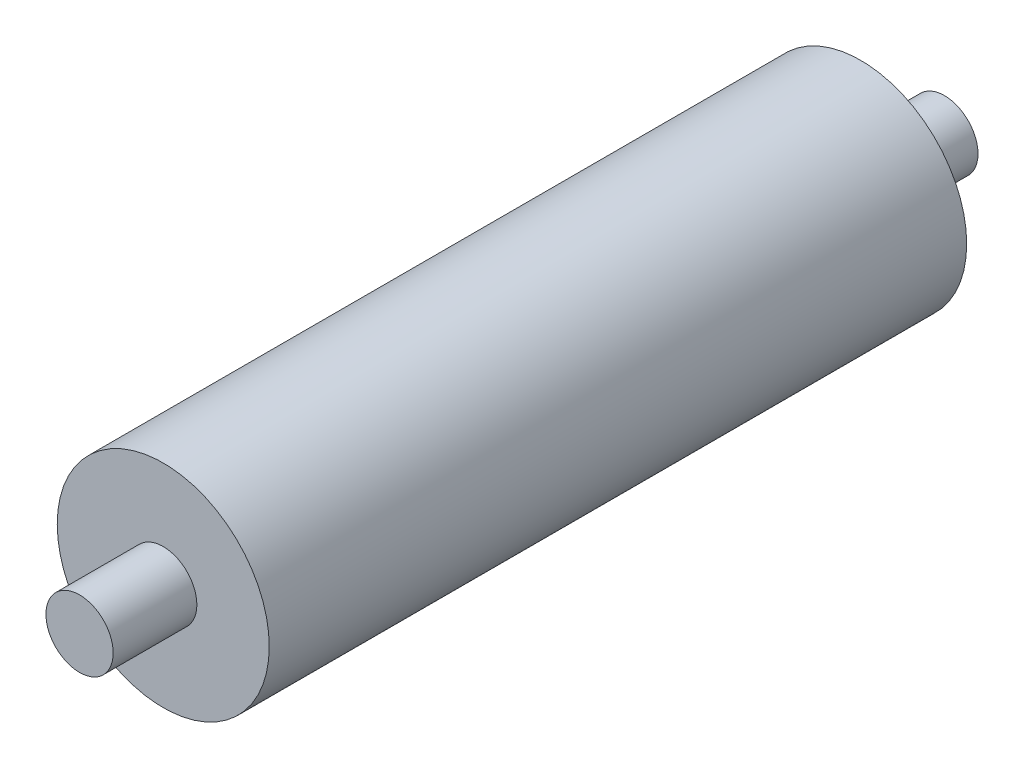
ISO-10303-21;
HEADER;
FILE_DESCRIPTION(('STEP AP214'),'2;1');
FILE_NAME('part.step','',(''),(''),'','','');
FILE_SCHEMA(('AUTOMOTIVE_DESIGN { 1 0 10303 214 1 1 1 1 }'));
ENDSEC;
DATA;
#1=APPLICATION_CONTEXT('core data for automotive mechanical design processes');
#2=APPLICATION_PROTOCOL_DEFINITION('international standard','automotive_design',2000,#1);
#3=PRODUCT_CONTEXT('',#1,'mechanical');
#4=PRODUCT('Part','Part','',(#3));
#5=PRODUCT_RELATED_PRODUCT_CATEGORY('part','',(#4));
#6=PRODUCT_DEFINITION_FORMATION('','',#4);
#7=PRODUCT_DEFINITION_CONTEXT('part definition',#1,'design');
#8=PRODUCT_DEFINITION('design','',#6,#7);
#9=PRODUCT_DEFINITION_SHAPE('','',#8);
#10=(LENGTH_UNIT() NAMED_UNIT(*) SI_UNIT(.MILLI.,.METRE.));
#11=(NAMED_UNIT(*) PLANE_ANGLE_UNIT() SI_UNIT($,.RADIAN.));
#12=(NAMED_UNIT(*) SI_UNIT($,.STERADIAN.) SOLID_ANGLE_UNIT());
#13=UNCERTAINTY_MEASURE_WITH_UNIT(LENGTH_MEASURE(1.E-05),#10,'distance_accuracy_value','');
#14=(GEOMETRIC_REPRESENTATION_CONTEXT(3) GLOBAL_UNCERTAINTY_ASSIGNED_CONTEXT((#13)) GLOBAL_UNIT_ASSIGNED_CONTEXT((#10,
#11,#12)) REPRESENTATION_CONTEXT('',''));
#15=CARTESIAN_POINT('',(0.,0.,0.));
#16=DIRECTION('',(0.,0.,1.));
#17=DIRECTION('',(1.,0.,0.));
#18=AXIS2_PLACEMENT_3D('',#15,#16,#17);
#19=CARTESIAN_POINT('',(0.,-19.,-127.5));
#20=DIRECTION('',(0.,1.,0.));
#21=DIRECTION('',(0.,0.,1.));
#22=AXIS2_PLACEMENT_3D('',#19,#20,#21);
#23=CYLINDRICAL_SURFACE('',#22,1.5);
#24=CARTESIAN_POINT('',(0.,-3.5,-126.));
#25=CARTESIAN_POINT('',(0.080152197682405,-3.49999299268885,-126.000009221439));
#26=CARTESIAN_POINT('',(0.160419992198241,-3.4972151640971,-126.006462129756));
#27=CARTESIAN_POINT('',(0.318671611361212,-3.48637069204866,-126.032039707285));
#28=CARTESIAN_POINT('',(0.396649149090577,-3.47829069608751,-126.05119636979));
#29=CARTESIAN_POINT('',(0.547768164746409,-3.45770786336707,-126.101335275199));
#30=CARTESIAN_POINT('',(0.620925386146732,-3.44522036823866,-126.132276527463));
#31=CARTESIAN_POINT('',(0.760936446071881,-3.4170283792682,-126.20493210375));
#32=CARTESIAN_POINT('',(0.827791985611414,-3.40132475720839,-126.246643509151));
#33=CARTESIAN_POINT('',(0.956920783546129,-3.36733908702934,-126.341963854125));
#34=CARTESIAN_POINT('',(1.01882024425247,-3.34896947381213,-126.396047638078));
#35=CARTESIAN_POINT('',(1.13299518436931,-3.3120882776969,-126.513571926116));
#36=CARTESIAN_POINT('',(1.18526532055665,-3.29357662187922,-126.57701759007));
#37=CARTESIAN_POINT('',(1.28142843548186,-3.25741027462363,-126.715516363707));
#38=CARTESIAN_POINT('',(1.32473406006015,-3.23985230076501,-126.791005229642));
#39=CARTESIAN_POINT('',(1.39786599574425,-3.2089808436345,-126.949054713467));
#40=CARTESIAN_POINT('',(1.42769964537364,-3.19566505070703,-127.03161145208));
#41=CARTESIAN_POINT('',(1.47147459991436,-3.17573899533535,-127.197150369309));
#42=CARTESIAN_POINT('',(1.48613747209695,-3.16882610719817,-127.279903850927));
#43=CARTESIAN_POINT('',(1.50140303570396,-3.16162424842019,-127.446962984768));
#44=CARTESIAN_POINT('',(1.50201414304565,-3.16133131294301,-127.53126767765));
#45=CARTESIAN_POINT('',(1.48969999758096,-3.16714786968021,-127.691649951849));
#46=CARTESIAN_POINT('',(1.47788056910827,-3.17273435527608,-127.767835311606));
#47=CARTESIAN_POINT('',(1.44290386406529,-3.18879205821456,-127.917013792889));
#48=CARTESIAN_POINT('',(1.41974426417223,-3.19926427650311,-127.990006256929));
#49=CARTESIAN_POINT('',(1.36228829534659,-3.22415342810443,-128.132623575738));
#50=CARTESIAN_POINT('',(1.3277598721403,-3.23865147551048,-128.202140147114));
#51=CARTESIAN_POINT('',(1.24871152436694,-3.26994246945712,-128.334673162029));
#52=CARTESIAN_POINT('',(1.20418753740298,-3.28673634798108,-128.397686947463));
#53=CARTESIAN_POINT('',(1.1017170269606,-3.32256202266194,-128.521388751812));
#54=CARTESIAN_POINT('',(1.04292364428054,-3.34165927694225,-128.581358364736));
#55=CARTESIAN_POINT('',(0.915936662025546,-3.3786730287964,-128.690835795328));
#56=CARTESIAN_POINT('',(0.847740608139985,-3.39658921627429,-128.740340872939));
#57=CARTESIAN_POINT('',(0.701592911506299,-3.4297984684468,-128.828621966404));
#58=CARTESIAN_POINT('',(0.623435574851138,-3.44501227516836,-128.867089509353));
#59=CARTESIAN_POINT('',(0.460939847079478,-3.47048698130307,-128.930075118807));
#60=CARTESIAN_POINT('',(0.376605107828834,-3.48075078019997,-128.954601352989));
#61=CARTESIAN_POINT('',(0.210138119470688,-3.49461763446686,-128.987466930229));
#62=CARTESIAN_POINT('',(0.128228980505475,-3.49861624982293,-128.996769382657));
#63=CARTESIAN_POINT('',(-0.036071650559258,-3.50077708325871,-129.001814788204));
#64=CARTESIAN_POINT('',(-0.118462985950308,-3.49894110265833,-128.997561926266));
#65=CARTESIAN_POINT('',(-0.276771219813303,-3.48989338160075,-128.976292183973));
#66=CARTESIAN_POINT('',(-0.352799465751992,-3.48297259736823,-128.959965839276));
#67=CARTESIAN_POINT('',(-0.500945568196319,-3.46476944004986,-128.915989552881));
#68=CARTESIAN_POINT('',(-0.573062936850428,-3.45348652424256,-128.888338202139));
#69=CARTESIAN_POINT('',(-0.713888482618995,-3.42719375756865,-128.821599420249));
#70=CARTESIAN_POINT('',(-0.782419874757515,-3.41207852694255,-128.782181834886));
#71=CARTESIAN_POINT('',(-0.912142452825162,-3.37971494195702,-128.693390527763));
#72=CARTESIAN_POINT('',(-0.973330487571125,-3.36246567824313,-128.644012555991));
#73=CARTESIAN_POINT('',(-1.09148379765634,-3.32607394349023,-128.532355206076));
#74=CARTESIAN_POINT('',(-1.14778308774278,-3.30688677499573,-128.46938389496));
#75=CARTESIAN_POINT('',(-1.24921715724401,-3.26992018844849,-128.334608850693));
#76=CARTESIAN_POINT('',(-1.29434883220192,-3.2521411627736,-128.262802669847));
#77=CARTESIAN_POINT('',(-1.37281937806384,-3.21981484643715,-128.110593073486));
#78=CARTESIAN_POINT('',(-1.40593207473353,-3.20533127997694,-128.030058495343));
#79=CARTESIAN_POINT('',(-1.45782942550893,-3.18206803761103,-127.863736836762));
#80=CARTESIAN_POINT('',(-1.47662682249981,-3.17328328988834,-127.777954501329));
#81=CARTESIAN_POINT('',(-1.49805974083905,-3.16321740581935,-127.611004413381));
#82=CARTESIAN_POINT('',(-1.50187346166243,-3.1613896288168,-127.53002036462));
#83=CARTESIAN_POINT('',(-1.49641325085792,-3.16397809086751,-127.368605128168));
#84=CARTESIAN_POINT('',(-1.48714162748686,-3.16839322866983,-127.288173845485));
#85=CARTESIAN_POINT('',(-1.45678214099438,-3.1824582711803,-127.134479146134));
#86=CARTESIAN_POINT('',(-1.43633482013379,-3.19182357178317,-127.061060583353));
#87=CARTESIAN_POINT('',(-1.38485117000435,-3.21449437287189,-126.918689637826));
#88=CARTESIAN_POINT('',(-1.35381183006238,-3.22780099349553,-126.849738531547));
#89=CARTESIAN_POINT('',(-1.2798160222702,-3.25787626150961,-126.713589563092));
#90=CARTESIAN_POINT('',(-1.23624027712766,-3.27480834339631,-126.64676510618));
#91=CARTESIAN_POINT('',(-1.13924888881304,-3.30979879908541,-126.521009136469));
#92=CARTESIAN_POINT('',(-1.08582952534293,-3.32785759700647,-126.462080622456));
#93=CARTESIAN_POINT('',(-0.965671675541751,-3.36477750877144,-126.348996902686));
#94=CARTESIAN_POINT('',(-0.898214817981342,-3.38358948911939,-126.295585266131));
#95=CARTESIAN_POINT('',(-0.754612613706933,-3.41848089249468,-126.200785073307));
#96=CARTESIAN_POINT('',(-0.67846334938271,-3.43455907522587,-126.15940196825));
#97=CARTESIAN_POINT('',(-0.520626802896573,-3.46197513636854,-126.090655430429));
#98=CARTESIAN_POINT('',(-0.4390364028582,-3.47337868320289,-126.063096470021));
#99=CARTESIAN_POINT('',(-0.271925657404341,-3.49042295491408,-126.022365285233));
#100=CARTESIAN_POINT('',(-0.18641835271133,-3.49608152963086,-126.009148490353));
#101=CARTESIAN_POINT('',(-0.0670267606132239,-3.49952115812385,-126.001119489046));
#102=CARTESIAN_POINT('',(-0.0335234910607528,-3.50000293079341,-125.999996143152));
#103=CARTESIAN_POINT('',(0.,-3.5,-126.));
#104=B_SPLINE_CURVE_WITH_KNOTS('',3,(#24,#25,#26,#27,#28,#29,#30,#31,#32,#33,#34,#35,#36,#37,
#38,#39,#40,#41,#42,#43,#44,#45,#46,#47,#48,#49,#50,#51,#52,#53,#54,#55,#56,#57,#58,#59,#60,#61,
#62,#63,#64,#65,#66,#67,#68,#69,#70,#71,#72,#73,#74,#75,#76,#77,#78,#79,#80,#81,#82,#83,#84,#85,
#86,#87,#88,#89,#90,#91,#92,#93,#94,#95,#96,#97,#98,#99,#100,#101,#102,#103),.UNSPECIFIED.,.T.,
.F.,(4,2,2,2,2,2,2,2,2,2,2,2,2,2,2,2,2,2,2,2,2,2,2,2,2,2,2,2,2,2,2,2,2,2,2,2,2,2,2,4),(0.,
0.240357161374421,0.481321951711668,0.721456131375696,0.961525304807646,1.21311371779254,
1.46484131710873,1.72984780430034,1.9947097611413,2.2462971341405,2.49773382188958,
2.72855360159805,2.95942069041215,3.19532704432398,3.43132944942381,3.68854918859161,
3.94583619550725,4.2097362229686,4.47348148178613,4.71978673747256,4.96601595851026,
5.19915597113059,5.43232499957121,5.67277527577343,5.91332836788289,6.17201425189599,
6.43077196675481,6.69417345394932,6.95734019712949,7.19934244432576,7.44130200762145,
7.67066022550949,7.90008369050327,8.14372375039561,8.38745608120078,8.6504208466696,
8.91350460007057,9.17275427816966,9.43119596989054,9.53172485598111),.UNSPECIFIED.);
#105=CARTESIAN_POINT('',(0.,-3.5,-126.));
#106=VERTEX_POINT('',#105);
#107=EDGE_CURVE('E137',#106,#106,#104,.T.);
#108=ORIENTED_EDGE('',*,*,#107,.T.);
#109=EDGE_LOOP('',(#108));
#110=FACE_BOUND('',#109,.T.);
#111=CARTESIAN_POINT('',(0.,-6.025,-126.));
#112=CARTESIAN_POINT('',(-0.0828872550337828,-6.02499859116748,-126.000002346101));
#113=CARTESIAN_POINT('',(-0.165800786849745,-6.02327249950255,-126.006893411997));
#114=CARTESIAN_POINT('',(-0.32925228857899,-6.01655401368184,-126.034234765777));
#115=CARTESIAN_POINT('',(-0.40978887225088,-6.01155975137994,-126.054692808882));
#116=CARTESIAN_POINT('',(-0.566102426100287,-5.99885806708042,-126.108471597747));
#117=CARTESIAN_POINT('',(-0.641884960748521,-5.9911538895127,-126.14177696671));
#118=CARTESIAN_POINT('',(-0.786787133638383,-5.97385325831286,-126.220251076105));
#119=CARTESIAN_POINT('',(-0.855906560558069,-5.96425674469426,-126.26542019263));
#120=CARTESIAN_POINT('',(-0.986933236577793,-5.9439943081781,-126.367314772539));
#121=CARTESIAN_POINT('',(-1.04868490837686,-5.93331199594215,-126.424237044583));
#122=CARTESIAN_POINT('',(-1.16187111176273,-5.91219103623551,-126.547600712877));
#123=CARTESIAN_POINT('',(-1.21330448774849,-5.90175241617277,-126.614043173918));
#124=CARTESIAN_POINT('',(-1.30512419623519,-5.88213563718997,-126.755767134994));
#125=CARTESIAN_POINT('',(-1.34533678960092,-5.87297829185401,-126.831164339259));
#126=CARTESIAN_POINT('',(-1.41245625361828,-5.85719977754789,-126.987913338268));
#127=CARTESIAN_POINT('',(-1.43936523215882,-5.85057820683488,-127.069264187343));
#128=CARTESIAN_POINT('',(-1.47858345652946,-5.84078935441607,-127.233901293587));
#129=CARTESIAN_POINT('',(-1.49117228651339,-5.83755602397849,-127.31711693288));
#130=CARTESIAN_POINT('',(-1.50226367140077,-5.83471201617127,-127.48453698922));
#131=CARTESIAN_POINT('',(-1.50076849782139,-5.83510075462163,-127.568741244633));
#132=CARTESIAN_POINT('',(-1.48395745353287,-5.839397575927,-127.733607789774));
#133=CARTESIAN_POINT('',(-1.46897444143908,-5.84322089403257,-127.814306574171));
#134=CARTESIAN_POINT('',(-1.42614388773028,-5.85382103430606,-127.972007523575));
#135=CARTESIAN_POINT('',(-1.39829543640653,-5.8605980653276,-128.049009426753));
#136=CARTESIAN_POINT('',(-1.33024009448832,-5.87642003332213,-128.198024873178));
#137=CARTESIAN_POINT('',(-1.28991215014784,-5.88548701758093,-128.269980691975));
#138=CARTESIAN_POINT('',(-1.19812726244859,-5.90485478754089,-128.40622331775));
#139=CARTESIAN_POINT('',(-1.14666838651303,-5.9151557873558,-128.470508789975));
#140=CARTESIAN_POINT('',(-1.03235686589153,-5.93618806681882,-128.591493697283));
#141=CARTESIAN_POINT('',(-0.969223253300287,-5.94692327814197,-128.64792730967));
#142=CARTESIAN_POINT('',(-0.834259893758132,-5.96735171193282,-128.74945637641));
#143=CARTESIAN_POINT('',(-0.762429885585538,-5.97704490308387,-128.794551490052));
#144=CARTESIAN_POINT('',(-0.611735374011842,-5.99434473447618,-128.872219949138));
#145=CARTESIAN_POINT('',(-0.53284789141595,-6.00194420380702,-128.904750410349));
#146=CARTESIAN_POINT('',(-0.370492835696125,-6.01414815334149,-128.95601444052));
#147=CARTESIAN_POINT('',(-0.28702613444418,-6.01875320154438,-128.974750626149));
#148=CARTESIAN_POINT('',(-0.120154954564742,-6.02436550321362,-128.997488968189));
#149=CARTESIAN_POINT('',(-0.0368027081353545,-6.02546114009905,-129.001853159935));
#150=CARTESIAN_POINT('',(0.129441114102535,-6.02418276028296,-128.996716186596));
#151=CARTESIAN_POINT('',(0.212332730350843,-6.02180905315293,-128.987216258614));
#152=CARTESIAN_POINT('',(0.374046306761289,-6.01391530708979,-128.954919198746));
#153=CARTESIAN_POINT('',(0.452910144756595,-6.0084419651424,-128.932319305652));
#154=CARTESIAN_POINT('',(0.605723347624976,-5.99496568147754,-128.874688911149));
#155=CARTESIAN_POINT('',(0.679672217685561,-5.98696248553344,-128.839657160411));
#156=CARTESIAN_POINT('',(0.821998754937197,-5.96910233734336,-128.757453997599));
#157=CARTESIAN_POINT('',(0.89025522481351,-5.95921519235318,-128.710079461824));
#158=CARTESIAN_POINT('',(1.01797805834411,-5.93873193060506,-128.604795424172));
#159=CARTESIAN_POINT('',(1.07744291507297,-5.92813569275623,-128.546884120028));
#160=CARTESIAN_POINT('',(1.18738435638911,-5.90711080036238,-128.420490121747));
#161=CARTESIAN_POINT('',(1.23760708653199,-5.89669249380406,-128.351784526045));
#162=CARTESIAN_POINT('',(1.3258095911067,-5.87749091483707,-128.206706711314));
#163=CARTESIAN_POINT('',(1.36378990995017,-5.86870756973012,-128.130334833396));
#164=CARTESIAN_POINT('',(1.4261472474918,-5.85386683231566,-127.972502842129));
#165=CARTESIAN_POINT('',(1.45060487106394,-5.84779333025972,-127.891076168578));
#166=CARTESIAN_POINT('',(1.48543601433985,-5.83904387864131,-127.725092575135));
#167=CARTESIAN_POINT('',(1.49581258377088,-5.83636719339172,-127.640536337134));
#168=CARTESIAN_POINT('',(1.50202871540431,-5.834770182659,-127.4732762006));
#169=CARTESIAN_POINT('',(1.49827388917589,-5.8357450434812,-127.390588134891));
#170=CARTESIAN_POINT('',(1.47726136725297,-5.84109913470361,-127.227063937472));
#171=CARTESIAN_POINT('',(1.46000393858062,-5.84547829778167,-127.146227769173));
#172=CARTESIAN_POINT('',(1.41269676405682,-5.85708940199327,-126.989138850924));
#173=CARTESIAN_POINT('',(1.38272249831309,-5.86430449233831,-126.912862039147));
#174=CARTESIAN_POINT('',(1.31089234744519,-5.88077699173803,-126.766365814211));
#175=CARTESIAN_POINT('',(1.26903482793604,-5.89003468168631,-126.696147236015));
#176=CARTESIAN_POINT('',(1.1733521419805,-5.90984866967447,-126.561799286183));
#177=CARTESIAN_POINT('',(1.11924526042357,-5.92043237742737,-126.497874561106));
#178=CARTESIAN_POINT('',(1.00114952115639,-5.94154157158504,-126.379879936885));
#179=CARTESIAN_POINT('',(0.937158323080805,-5.95206704358803,-126.325812378305));
#180=CARTESIAN_POINT('',(0.799726465890748,-5.97209886183962,-126.228122728431));
#181=CARTESIAN_POINT('',(0.726137025658223,-5.98158356612061,-126.184705175576));
#182=CARTESIAN_POINT('',(0.572474544981394,-5.99823730155301,-126.110926506003));
#183=CARTESIAN_POINT('',(0.492406228681665,-6.00540800129152,-126.080555976052));
#184=CARTESIAN_POINT('',(0.34372704448587,-6.01555786049226,-126.038273878898));
#185=CARTESIAN_POINT('',(0.275828137403223,-6.01907442729511,-126.023952065301));
#186=CARTESIAN_POINT('',(0.138625543951506,-6.02379600073086,-126.004814496187));
#187=CARTESIAN_POINT('',(0.06932196182443,-6.02500117826358,-125.999998037861));
#188=CARTESIAN_POINT('',(0.,-6.025,-126.));
#189=B_SPLINE_CURVE_WITH_KNOTS('',3,(#111,#112,#113,#114,#115,#116,#117,#118,#119,#120,#121,
#122,#123,#124,#125,#126,#127,#128,#129,#130,#131,#132,#133,#134,#135,#136,#137,#138,#139,#140,
#141,#142,#143,#144,#145,#146,#147,#148,#149,#150,#151,#152,#153,#154,#155,#156,#157,#158,#159,
#160,#161,#162,#163,#164,#165,#166,#167,#168,#169,#170,#171,#172,#173,#174,#175,#176,#177,#178,
#179,#180,#181,#182,#183,#184,#185,#186,#187,#188),.UNSPECIFIED.,.T.,.F.,(4,2,2,2,2,2,2,2,2,2,2,
2,2,2,2,2,2,2,2,2,2,2,2,2,2,2,2,2,2,2,2,2,2,2,2,2,2,2,4),(0.,0.24840773608131,0.496957590749238,
0.745210877801459,0.993472035673221,1.24628776132301,1.49913178536846,1.75569731421545,
2.01222217854393,2.26364777823425,2.5150328278224,2.76037919569437,3.00574291454073,
3.25356555587028,3.50143125929753,3.75630388166518,4.01118416177807,4.2669268408128,
4.52262099492308,4.77182276550197,5.0210023010266,5.26652409053502,5.51207056053072,
5.76194578810565,6.0118637959836,6.26786167012397,6.52384815864347,6.7782918670561,
7.03268045830052,7.27982380441599,7.52696226324548,7.77265392631899,8.01837939742783,
8.27046493326648,8.52261024857274,8.77927386837315,9.03575199693601,9.24352079030184,
9.4512742210374),.UNSPECIFIED.);
#190=CARTESIAN_POINT('',(0.,-6.025,-126.));
#191=VERTEX_POINT('',#190);
#192=EDGE_CURVE('E92',#191,#191,#189,.T.);
#193=ORIENTED_EDGE('',*,*,#192,.T.);
#194=EDGE_LOOP('',(#193));
#195=FACE_BOUND('',#194,.T.);
#196=ADVANCED_FACE('F39',(#110,#195),#23,.F.);
#197=CARTESIAN_POINT('',(0.,0.,-125.));
#198=DIRECTION('',(0.,0.,1.));
#199=DIRECTION('',(1.,0.,0.));
#200=AXIS2_PLACEMENT_3D('',#197,#198,#199);
#201=CYLINDRICAL_SURFACE('',#200,19.);
#202=CARTESIAN_POINT('',(0.,0.,-125.));
#203=DIRECTION('',(0.,0.,1.));
#204=DIRECTION('',(1.,0.,0.));
#205=AXIS2_PLACEMENT_3D('',#202,#203,#204);
#206=CIRCLE('',#205,19.);
#207=CARTESIAN_POINT('',(19.,0.,-125.));
#208=VERTEX_POINT('',#207);
#209=EDGE_CURVE('E110',#208,#208,#206,.T.);
#210=ORIENTED_EDGE('',*,*,#209,.T.);
#211=EDGE_LOOP('',(#210));
#212=FACE_BOUND('',#211,.T.);
#213=CARTESIAN_POINT('',(0.,0.,0.));
#214=DIRECTION('',(0.,0.,1.));
#215=DIRECTION('',(1.,0.,0.));
#216=AXIS2_PLACEMENT_3D('',#213,#214,#215);
#217=CIRCLE('',#216,19.);
#218=CARTESIAN_POINT('',(19.,0.,0.));
#219=VERTEX_POINT('',#218);
#220=EDGE_CURVE('E109',#219,#219,#217,.T.);
#221=ORIENTED_EDGE('',*,*,#220,.F.);
#222=EDGE_LOOP('',(#221));
#223=FACE_BOUND('',#222,.T.);
#224=ADVANCED_FACE('F41',(#212,#223),#201,.T.);
#225=CARTESIAN_POINT('',(0.,0.,-125.));
#226=DIRECTION('',(0.,0.,1.));
#227=DIRECTION('',(1.,0.,0.));
#228=AXIS2_PLACEMENT_3D('',#225,#226,#227);
#229=PLANE('',#228);
#230=CARTESIAN_POINT('',(0.,0.,-125.));
#231=DIRECTION('',(0.,0.,1.));
#232=DIRECTION('',(1.,0.,0.));
#233=AXIS2_PLACEMENT_3D('',#230,#231,#232);
#234=CIRCLE('',#233,6.025);
#235=CARTESIAN_POINT('',(6.025,0.,-125.));
#236=VERTEX_POINT('',#235);
#237=EDGE_CURVE('E101',#236,#236,#234,.T.);
#238=ORIENTED_EDGE('',*,*,#237,.T.);
#239=EDGE_LOOP('',(#238));
#240=FACE_BOUND('',#239,.T.);
#241=ORIENTED_EDGE('',*,*,#209,.F.);
#242=EDGE_LOOP('',(#241));
#243=FACE_BOUND('',#242,.T.);
#244=ADVANCED_FACE('F258',(#240,#243),#229,.F.);
#245=CARTESIAN_POINT('',(0.,0.,0.));
#246=DIRECTION('',(0.,0.,1.));
#247=DIRECTION('',(1.,0.,0.));
#248=AXIS2_PLACEMENT_3D('',#245,#246,#247);
#249=PLANE('',#248);
#250=CARTESIAN_POINT('',(0.,0.,0.));
#251=DIRECTION('',(0.,0.,1.));
#252=DIRECTION('',(1.,0.,0.));
#253=AXIS2_PLACEMENT_3D('',#250,#251,#252);
#254=CIRCLE('',#253,6.025);
#255=CARTESIAN_POINT('',(6.025,0.,0.));
#256=VERTEX_POINT('',#255);
#257=EDGE_CURVE('E105',#256,#256,#254,.T.);
#258=ORIENTED_EDGE('',*,*,#257,.F.);
#259=EDGE_LOOP('',(#258));
#260=FACE_BOUND('',#259,.T.);
#261=ORIENTED_EDGE('',*,*,#220,.T.);
#262=EDGE_LOOP('',(#261));
#263=FACE_BOUND('',#262,.T.);
#264=ADVANCED_FACE('F277',(#260,#263),#249,.T.);
#265=CARTESIAN_POINT('',(0.,0.,15.));
#266=DIRECTION('',(0.,0.,1.));
#267=DIRECTION('',(1.,0.,0.));
#268=AXIS2_PLACEMENT_3D('',#265,#266,#267);
#269=PLANE('',#268);
#270=CARTESIAN_POINT('',(0.,0.,15.));
#271=DIRECTION('',(0.,0.,1.));
#272=DIRECTION('',(1.,0.,0.));
#273=AXIS2_PLACEMENT_3D('',#270,#271,#272);
#274=CIRCLE('',#273,6.025);
#275=CARTESIAN_POINT('',(6.025,0.,15.));
#276=VERTEX_POINT('',#275);
#277=EDGE_CURVE('E87',#276,#276,#274,.T.);
#278=ORIENTED_EDGE('',*,*,#277,.T.);
#279=EDGE_LOOP('',(#278));
#280=FACE_BOUND('',#279,.T.);
#281=ADVANCED_FACE('F156',(#280),#269,.T.);
#282=CARTESIAN_POINT('',(0.,0.,-140.));
#283=DIRECTION('',(0.,0.,1.));
#284=DIRECTION('',(1.,0.,0.));
#285=AXIS2_PLACEMENT_3D('',#282,#283,#284);
#286=CYLINDRICAL_SURFACE('',#285,6.025);
#287=ORIENTED_EDGE('',*,*,#257,.T.);
#288=EDGE_LOOP('',(#287));
#289=FACE_BOUND('',#288,.T.);
#290=ORIENTED_EDGE('',*,*,#277,.F.);
#291=EDGE_LOOP('',(#290));
#292=FACE_BOUND('',#291,.T.);
#293=ADVANCED_FACE('F268',(#289,#292),#286,.T.);
#294=ORIENTED_EDGE('',*,*,#192,.F.);
#295=EDGE_LOOP('',(#294));
#296=FACE_BOUND('',#295,.T.);
#297=CARTESIAN_POINT('',(0.,6.025,-126.));
#298=CARTESIAN_POINT('',(0.0828872550337827,6.02499859116748,-126.000002346101));
#299=CARTESIAN_POINT('',(0.165800786849745,6.02327249950255,-126.006893411997));
#300=CARTESIAN_POINT('',(0.32925228857899,6.01655401368184,-126.034234765777));
#301=CARTESIAN_POINT('',(0.40978887225088,6.01155975137994,-126.054692808882));
#302=CARTESIAN_POINT('',(0.566102426100287,5.99885806708042,-126.108471597747));
#303=CARTESIAN_POINT('',(0.641884960748521,5.9911538895127,-126.14177696671));
#304=CARTESIAN_POINT('',(0.786787133638383,5.97385325831286,-126.220251076105));
#305=CARTESIAN_POINT('',(0.855906560558069,5.96425674469426,-126.26542019263));
#306=CARTESIAN_POINT('',(0.986933236577793,5.9439943081781,-126.367314772539));
#307=CARTESIAN_POINT('',(1.04868490837686,5.93331199594215,-126.424237044583));
#308=CARTESIAN_POINT('',(1.16187111176273,5.91219103623551,-126.547600712877));
#309=CARTESIAN_POINT('',(1.21330448774849,5.90175241617277,-126.614043173918));
#310=CARTESIAN_POINT('',(1.30512419623519,5.88213563718997,-126.755767134994));
#311=CARTESIAN_POINT('',(1.34533678960092,5.87297829185401,-126.831164339259));
#312=CARTESIAN_POINT('',(1.41245625361828,5.85719977754789,-126.987913338268));
#313=CARTESIAN_POINT('',(1.43936523215882,5.85057820683488,-127.069264187343));
#314=CARTESIAN_POINT('',(1.47858345652946,5.84078935441607,-127.233901293587));
#315=CARTESIAN_POINT('',(1.49117228651339,5.83755602397849,-127.31711693288));
#316=CARTESIAN_POINT('',(1.50226367140077,5.83471201617127,-127.48453698922));
#317=CARTESIAN_POINT('',(1.50076849782139,5.83510075462163,-127.568741244633));
#318=CARTESIAN_POINT('',(1.48395745353287,5.839397575927,-127.733607789774));
#319=CARTESIAN_POINT('',(1.46897444143908,5.84322089403257,-127.814306574171));
#320=CARTESIAN_POINT('',(1.42614388773028,5.85382103430606,-127.972007523575));
#321=CARTESIAN_POINT('',(1.39829543640653,5.8605980653276,-128.049009426753));
#322=CARTESIAN_POINT('',(1.33024009448832,5.87642003332213,-128.198024873178));
#323=CARTESIAN_POINT('',(1.28991215014784,5.88548701758093,-128.269980691975));
#324=CARTESIAN_POINT('',(1.19812726244859,5.90485478754089,-128.40622331775));
#325=CARTESIAN_POINT('',(1.14666838651303,5.9151557873558,-128.470508789975));
#326=CARTESIAN_POINT('',(1.03235686589153,5.93618806681882,-128.591493697283));
#327=CARTESIAN_POINT('',(0.969223253300287,5.94692327814197,-128.64792730967));
#328=CARTESIAN_POINT('',(0.834259893758132,5.96735171193282,-128.74945637641));
#329=CARTESIAN_POINT('',(0.762429885585538,5.97704490308387,-128.794551490052));
#330=CARTESIAN_POINT('',(0.611735374011842,5.99434473447618,-128.872219949138));
#331=CARTESIAN_POINT('',(0.53284789141595,6.00194420380702,-128.904750410349));
#332=CARTESIAN_POINT('',(0.370492835696125,6.01414815334149,-128.95601444052));
#333=CARTESIAN_POINT('',(0.28702613444418,6.01875320154438,-128.974750626149));
#334=CARTESIAN_POINT('',(0.120154954564742,6.02436550321362,-128.997488968189));
#335=CARTESIAN_POINT('',(0.0368027081353545,6.02546114009905,-129.001853159935));
#336=CARTESIAN_POINT('',(-0.129441114102535,6.02418276028296,-128.996716186596));
#337=CARTESIAN_POINT('',(-0.212332730350843,6.02180905315293,-128.987216258614));
#338=CARTESIAN_POINT('',(-0.374046306761289,6.01391530708979,-128.954919198746));
#339=CARTESIAN_POINT('',(-0.452910144756595,6.0084419651424,-128.932319305652));
#340=CARTESIAN_POINT('',(-0.605723347624976,5.99496568147754,-128.874688911149));
#341=CARTESIAN_POINT('',(-0.679672217685561,5.98696248553344,-128.839657160411));
#342=CARTESIAN_POINT('',(-0.821998754937197,5.96910233734336,-128.757453997599));
#343=CARTESIAN_POINT('',(-0.89025522481351,5.95921519235318,-128.710079461824));
#344=CARTESIAN_POINT('',(-1.01797805834411,5.93873193060506,-128.604795424172));
#345=CARTESIAN_POINT('',(-1.07744291507297,5.92813569275623,-128.546884120028));
#346=CARTESIAN_POINT('',(-1.18738435638911,5.90711080036238,-128.420490121747));
#347=CARTESIAN_POINT('',(-1.23760708653199,5.89669249380406,-128.351784526045));
#348=CARTESIAN_POINT('',(-1.3258095911067,5.87749091483707,-128.206706711314));
#349=CARTESIAN_POINT('',(-1.36378990995017,5.86870756973012,-128.130334833396));
#350=CARTESIAN_POINT('',(-1.4261472474918,5.85386683231566,-127.972502842129));
#351=CARTESIAN_POINT('',(-1.45060487106394,5.84779333025972,-127.891076168578));
#352=CARTESIAN_POINT('',(-1.48543601433985,5.83904387864131,-127.725092575135));
#353=CARTESIAN_POINT('',(-1.49581258377088,5.83636719339172,-127.640536337134));
#354=CARTESIAN_POINT('',(-1.50202871540431,5.834770182659,-127.4732762006));
#355=CARTESIAN_POINT('',(-1.49827388917589,5.8357450434812,-127.390588134891));
#356=CARTESIAN_POINT('',(-1.47726136725297,5.84109913470361,-127.227063937472));
#357=CARTESIAN_POINT('',(-1.46000393858062,5.84547829778167,-127.146227769173));
#358=CARTESIAN_POINT('',(-1.41269676405682,5.85708940199327,-126.989138850924));
#359=CARTESIAN_POINT('',(-1.38272249831309,5.86430449233831,-126.912862039147));
#360=CARTESIAN_POINT('',(-1.31089234744519,5.88077699173803,-126.766365814211));
#361=CARTESIAN_POINT('',(-1.26903482793604,5.89003468168631,-126.696147236015));
#362=CARTESIAN_POINT('',(-1.1733521419805,5.90984866967447,-126.561799286183));
#363=CARTESIAN_POINT('',(-1.11924526042357,5.92043237742737,-126.497874561106));
#364=CARTESIAN_POINT('',(-1.00114952115639,5.94154157158504,-126.379879936885));
#365=CARTESIAN_POINT('',(-0.937158323080805,5.95206704358803,-126.325812378305));
#366=CARTESIAN_POINT('',(-0.799726465890748,5.97209886183962,-126.228122728431));
#367=CARTESIAN_POINT('',(-0.726137025658223,5.98158356612061,-126.184705175576));
#368=CARTESIAN_POINT('',(-0.572474544981394,5.99823730155301,-126.110926506003));
#369=CARTESIAN_POINT('',(-0.492406228681665,6.00540800129152,-126.080555976052));
#370=CARTESIAN_POINT('',(-0.34372704448587,6.01555786049226,-126.038273878898));
#371=CARTESIAN_POINT('',(-0.275828137403223,6.01907442729511,-126.023952065301));
#372=CARTESIAN_POINT('',(-0.138625543951506,6.02379600073086,-126.004814496187));
#373=CARTESIAN_POINT('',(-0.0693219618244301,6.02500117826358,-125.999998037861));
#374=CARTESIAN_POINT('',(0.,6.025,-126.));
#375=B_SPLINE_CURVE_WITH_KNOTS('',3,(#297,#298,#299,#300,#301,#302,#303,#304,#305,#306,#307,
#308,#309,#310,#311,#312,#313,#314,#315,#316,#317,#318,#319,#320,#321,#322,#323,#324,#325,#326,
#327,#328,#329,#330,#331,#332,#333,#334,#335,#336,#337,#338,#339,#340,#341,#342,#343,#344,#345,
#346,#347,#348,#349,#350,#351,#352,#353,#354,#355,#356,#357,#358,#359,#360,#361,#362,#363,#364,
#365,#366,#367,#368,#369,#370,#371,#372,#373,#374),.UNSPECIFIED.,.T.,.F.,(4,2,2,2,2,2,2,2,2,2,2,
2,2,2,2,2,2,2,2,2,2,2,2,2,2,2,2,2,2,2,2,2,2,2,2,2,2,2,4),(0.,0.24840773608131,0.496957590749238,
0.745210877801459,0.993472035673221,1.24628776132301,1.49913178536846,1.75569731421545,
2.01222217854393,2.26364777823425,2.5150328278224,2.76037919569437,3.00574291454073,
3.25356555587028,3.50143125929753,3.75630388166518,4.01118416177807,4.2669268408128,
4.52262099492308,4.77182276550197,5.0210023010266,5.26652409053502,5.51207056053072,
5.76194578810565,6.0118637959836,6.26786167012397,6.52384815864347,6.7782918670561,
7.03268045830052,7.27982380441599,7.52696226324548,7.77265392631899,8.01837939742783,
8.27046493326648,8.52261024857274,8.77927386837315,9.03575199693601,9.24352079030184,
9.4512742210374),.UNSPECIFIED.);
#376=CARTESIAN_POINT('',(0.,6.025,-126.));
#377=VERTEX_POINT('',#376);
#378=EDGE_CURVE('E128',#377,#377,#375,.T.);
#379=ORIENTED_EDGE('',*,*,#378,.F.);
#380=EDGE_LOOP('',(#379));
#381=FACE_BOUND('',#380,.T.);
#382=CARTESIAN_POINT('',(0.,0.,-140.));
#383=DIRECTION('',(0.,0.,1.));
#384=DIRECTION('',(1.,0.,0.));
#385=AXIS2_PLACEMENT_3D('',#382,#383,#384);
#386=CIRCLE('',#385,6.025);
#387=CARTESIAN_POINT('',(6.025,0.,-140.));
#388=VERTEX_POINT('',#387);
#389=EDGE_CURVE('E91',#388,#388,#386,.T.);
#390=ORIENTED_EDGE('',*,*,#389,.T.);
#391=EDGE_LOOP('',(#390));
#392=FACE_BOUND('',#391,.T.);
#393=ORIENTED_EDGE('',*,*,#237,.F.);
#394=EDGE_LOOP('',(#393));
#395=FACE_BOUND('',#394,.T.);
#396=ADVANCED_FACE('F142',(#296,#381,#392,#395),#286,.T.);
#397=CARTESIAN_POINT('',(0.,0.,-140.));
#398=DIRECTION('',(0.,0.,1.));
#399=DIRECTION('',(1.,0.,0.));
#400=AXIS2_PLACEMENT_3D('',#397,#398,#399);
#401=PLANE('',#400);
#402=CARTESIAN_POINT('',(0.,0.,-140.));
#403=DIRECTION('',(0.,0.,-1.));
#404=DIRECTION('',(-1.,0.,0.));
#405=AXIS2_PLACEMENT_3D('',#402,#403,#404);
#406=CIRCLE('',#405,3.5);
#407=CARTESIAN_POINT('',(-3.5,0.,-140.));
#408=VERTEX_POINT('',#407);
#409=EDGE_CURVE('E83',#408,#408,#406,.T.);
#410=ORIENTED_EDGE('',*,*,#409,.F.);
#411=EDGE_LOOP('',(#410));
#412=FACE_BOUND('',#411,.T.);
#413=ORIENTED_EDGE('',*,*,#389,.F.);
#414=EDGE_LOOP('',(#413));
#415=FACE_BOUND('',#414,.T.);
#416=ADVANCED_FACE('F152',(#412,#415),#401,.F.);
#417=CARTESIAN_POINT('',(0.,3.5,-126.));
#418=CARTESIAN_POINT('',(-0.0801521976824051,3.49999299268885,-126.000009221439));
#419=CARTESIAN_POINT('',(-0.160419992198241,3.4972151640971,-126.006462129756));
#420=CARTESIAN_POINT('',(-0.318671611361212,3.48637069204866,-126.032039707285));
#421=CARTESIAN_POINT('',(-0.396649149090577,3.47829069608751,-126.05119636979));
#422=CARTESIAN_POINT('',(-0.547768164746409,3.45770786336707,-126.101335275199));
#423=CARTESIAN_POINT('',(-0.620925386146732,3.44522036823866,-126.132276527463));
#424=CARTESIAN_POINT('',(-0.760936446071881,3.4170283792682,-126.20493210375));
#425=CARTESIAN_POINT('',(-0.827791985611414,3.40132475720839,-126.246643509151));
#426=CARTESIAN_POINT('',(-0.956920783546129,3.36733908702934,-126.341963854125));
#427=CARTESIAN_POINT('',(-1.01882024425247,3.34896947381213,-126.396047638078));
#428=CARTESIAN_POINT('',(-1.13299518436931,3.3120882776969,-126.513571926116));
#429=CARTESIAN_POINT('',(-1.18526532055665,3.29357662187922,-126.57701759007));
#430=CARTESIAN_POINT('',(-1.28142843548186,3.25741027462363,-126.715516363707));
#431=CARTESIAN_POINT('',(-1.32473406006015,3.23985230076501,-126.791005229642));
#432=CARTESIAN_POINT('',(-1.39786599574425,3.2089808436345,-126.949054713467));
#433=CARTESIAN_POINT('',(-1.42769964537364,3.19566505070703,-127.03161145208));
#434=CARTESIAN_POINT('',(-1.47147459991436,3.17573899533535,-127.197150369309));
#435=CARTESIAN_POINT('',(-1.48613747209695,3.16882610719817,-127.279903850927));
#436=CARTESIAN_POINT('',(-1.50140303570396,3.16162424842019,-127.446962984768));
#437=CARTESIAN_POINT('',(-1.50201414304565,3.16133131294301,-127.53126767765));
#438=CARTESIAN_POINT('',(-1.48969999758096,3.16714786968021,-127.691649951849));
#439=CARTESIAN_POINT('',(-1.47788056910827,3.17273435527608,-127.767835311606));
#440=CARTESIAN_POINT('',(-1.44290386406529,3.18879205821456,-127.917013792889));
#441=CARTESIAN_POINT('',(-1.41974426417223,3.19926427650311,-127.990006256929));
#442=CARTESIAN_POINT('',(-1.36228829534659,3.22415342810443,-128.132623575738));
#443=CARTESIAN_POINT('',(-1.3277598721403,3.23865147551048,-128.202140147114));
#444=CARTESIAN_POINT('',(-1.24871152436694,3.26994246945712,-128.334673162029));
#445=CARTESIAN_POINT('',(-1.20418753740298,3.28673634798108,-128.397686947463));
#446=CARTESIAN_POINT('',(-1.1017170269606,3.32256202266194,-128.521388751812));
#447=CARTESIAN_POINT('',(-1.04292364428054,3.34165927694225,-128.581358364736));
#448=CARTESIAN_POINT('',(-0.915936662025546,3.3786730287964,-128.690835795328));
#449=CARTESIAN_POINT('',(-0.847740608139985,3.39658921627429,-128.740340872939));
#450=CARTESIAN_POINT('',(-0.701592911506299,3.4297984684468,-128.828621966404));
#451=CARTESIAN_POINT('',(-0.623435574851138,3.44501227516836,-128.867089509353));
#452=CARTESIAN_POINT('',(-0.460939847079478,3.47048698130307,-128.930075118807));
#453=CARTESIAN_POINT('',(-0.376605107828834,3.48075078019997,-128.954601352989));
#454=CARTESIAN_POINT('',(-0.210138119470688,3.49461763446686,-128.987466930229));
#455=CARTESIAN_POINT('',(-0.128228980505475,3.49861624982293,-128.996769382657));
#456=CARTESIAN_POINT('',(0.036071650559258,3.50077708325871,-129.001814788204));
#457=CARTESIAN_POINT('',(0.118462985950308,3.49894110265833,-128.997561926266));
#458=CARTESIAN_POINT('',(0.276771219813303,3.48989338160075,-128.976292183973));
#459=CARTESIAN_POINT('',(0.352799465751992,3.48297259736823,-128.959965839276));
#460=CARTESIAN_POINT('',(0.500945568196319,3.46476944004986,-128.915989552881));
#461=CARTESIAN_POINT('',(0.573062936850428,3.45348652424256,-128.888338202139));
#462=CARTESIAN_POINT('',(0.713888482618995,3.42719375756865,-128.821599420249));
#463=CARTESIAN_POINT('',(0.782419874757515,3.41207852694255,-128.782181834886));
#464=CARTESIAN_POINT('',(0.912142452825162,3.37971494195702,-128.693390527763));
#465=CARTESIAN_POINT('',(0.973330487571125,3.36246567824313,-128.644012555991));
#466=CARTESIAN_POINT('',(1.09148379765634,3.32607394349023,-128.532355206076));
#467=CARTESIAN_POINT('',(1.14778308774278,3.30688677499573,-128.46938389496));
#468=CARTESIAN_POINT('',(1.24921715724401,3.26992018844849,-128.334608850693));
#469=CARTESIAN_POINT('',(1.29434883220192,3.2521411627736,-128.262802669847));
#470=CARTESIAN_POINT('',(1.37281937806384,3.21981484643715,-128.110593073486));
#471=CARTESIAN_POINT('',(1.40593207473353,3.20533127997694,-128.030058495343));
#472=CARTESIAN_POINT('',(1.45782942550893,3.18206803761103,-127.863736836762));
#473=CARTESIAN_POINT('',(1.47662682249981,3.17328328988834,-127.777954501329));
#474=CARTESIAN_POINT('',(1.49805974083905,3.16321740581935,-127.611004413381));
#475=CARTESIAN_POINT('',(1.50187346166243,3.1613896288168,-127.53002036462));
#476=CARTESIAN_POINT('',(1.49641325085792,3.16397809086751,-127.368605128168));
#477=CARTESIAN_POINT('',(1.48714162748686,3.16839322866983,-127.288173845485));
#478=CARTESIAN_POINT('',(1.45678214099438,3.1824582711803,-127.134479146134));
#479=CARTESIAN_POINT('',(1.43633482013379,3.19182357178317,-127.061060583353));
#480=CARTESIAN_POINT('',(1.38485117000435,3.21449437287189,-126.918689637826));
#481=CARTESIAN_POINT('',(1.35381183006238,3.22780099349553,-126.849738531547));
#482=CARTESIAN_POINT('',(1.2798160222702,3.25787626150961,-126.713589563092));
#483=CARTESIAN_POINT('',(1.23624027712766,3.27480834339631,-126.64676510618));
#484=CARTESIAN_POINT('',(1.13924888881304,3.30979879908541,-126.521009136469));
#485=CARTESIAN_POINT('',(1.08582952534293,3.32785759700647,-126.462080622456));
#486=CARTESIAN_POINT('',(0.965671675541751,3.36477750877144,-126.348996902686));
#487=CARTESIAN_POINT('',(0.898214817981342,3.38358948911939,-126.295585266131));
#488=CARTESIAN_POINT('',(0.754612613706933,3.41848089249468,-126.200785073307));
#489=CARTESIAN_POINT('',(0.67846334938271,3.43455907522587,-126.15940196825));
#490=CARTESIAN_POINT('',(0.520626802896573,3.46197513636854,-126.090655430429));
#491=CARTESIAN_POINT('',(0.4390364028582,3.47337868320289,-126.063096470021));
#492=CARTESIAN_POINT('',(0.271925657404341,3.49042295491408,-126.022365285233));
#493=CARTESIAN_POINT('',(0.18641835271133,3.49608152963086,-126.009148490353));
#494=CARTESIAN_POINT('',(0.0670267606132239,3.49952115812385,-126.001119489046));
#495=CARTESIAN_POINT('',(0.0335234910607528,3.50000293079341,-125.999996143152));
#496=CARTESIAN_POINT('',(0.,3.5,-126.));
#497=B_SPLINE_CURVE_WITH_KNOTS('',3,(#417,#418,#419,#420,#421,#422,#423,#424,#425,#426,#427,
#428,#429,#430,#431,#432,#433,#434,#435,#436,#437,#438,#439,#440,#441,#442,#443,#444,#445,#446,
#447,#448,#449,#450,#451,#452,#453,#454,#455,#456,#457,#458,#459,#460,#461,#462,#463,#464,#465,
#466,#467,#468,#469,#470,#471,#472,#473,#474,#475,#476,#477,#478,#479,#480,#481,#482,#483,#484,
#485,#486,#487,#488,#489,#490,#491,#492,#493,#494,#495,#496),.UNSPECIFIED.,.T.,.F.,(4,2,2,2,2,2,
2,2,2,2,2,2,2,2,2,2,2,2,2,2,2,2,2,2,2,2,2,2,2,2,2,2,2,2,2,2,2,2,2,4),(0.,0.240357161374421,
0.481321951711668,0.721456131375696,0.961525304807646,1.21311371779254,1.46484131710873,
1.72984780430034,1.9947097611413,2.2462971341405,2.49773382188958,2.72855360159805,
2.95942069041215,3.19532704432398,3.43132944942381,3.68854918859161,3.94583619550725,
4.2097362229686,4.47348148178613,4.71978673747256,4.96601595851026,5.19915597113059,
5.43232499957121,5.67277527577343,5.91332836788289,6.17201425189599,6.43077196675481,
6.69417345394932,6.95734019712949,7.19934244432576,7.44130200762145,7.67066022550949,
7.90008369050327,8.14372375039561,8.38745608120078,8.6504208466696,8.91350460007057,
9.17275427816966,9.43119596989054,9.53172485598111),.UNSPECIFIED.);
#498=CARTESIAN_POINT('',(0.,3.5,-126.));
#499=VERTEX_POINT('',#498);
#500=EDGE_CURVE('E82',#499,#499,#497,.T.);
#501=ORIENTED_EDGE('',*,*,#500,.T.);
#502=EDGE_LOOP('',(#501));
#503=FACE_BOUND('',#502,.T.);
#504=ORIENTED_EDGE('',*,*,#378,.T.);
#505=EDGE_LOOP('',(#504));
#506=FACE_BOUND('',#505,.T.);
#507=ADVANCED_FACE('F146',(#503,#506),#23,.F.);
#508=CARTESIAN_POINT('',(0.,0.,-118.));
#509=DIRECTION('',(0.,0.,-1.));
#510=DIRECTION('',(-1.,0.,0.));
#511=AXIS2_PLACEMENT_3D('',#508,#509,#510);
#512=CYLINDRICAL_SURFACE('',#511,3.5);
#513=ORIENTED_EDGE('',*,*,#500,.F.);
#514=EDGE_LOOP('',(#513));
#515=FACE_BOUND('',#514,.T.);
#516=CARTESIAN_POINT('',(0.,0.,-118.));
#517=DIRECTION('',(0.,0.,-1.));
#518=DIRECTION('',(-1.,0.,0.));
#519=AXIS2_PLACEMENT_3D('',#516,#517,#518);
#520=CIRCLE('',#519,3.5);
#521=CARTESIAN_POINT('',(-3.5,0.,-118.));
#522=VERTEX_POINT('',#521);
#523=EDGE_CURVE('E78',#522,#522,#520,.T.);
#524=ORIENTED_EDGE('',*,*,#523,.F.);
#525=EDGE_LOOP('',(#524));
#526=FACE_BOUND('',#525,.T.);
#527=ORIENTED_EDGE('',*,*,#409,.T.);
#528=EDGE_LOOP('',(#527));
#529=FACE_BOUND('',#528,.T.);
#530=ORIENTED_EDGE('',*,*,#107,.F.);
#531=EDGE_LOOP('',(#530));
#532=FACE_BOUND('',#531,.T.);
#533=ADVANCED_FACE('F151',(#515,#526,#529,#532),#512,.F.);
#534=CARTESIAN_POINT('',(0.,0.,-118.));
#535=DIRECTION('',(0.,0.,-1.));
#536=DIRECTION('',(-1.,0.,0.));
#537=AXIS2_PLACEMENT_3D('',#534,#535,#536);
#538=PLANE('',#537);
#539=ORIENTED_EDGE('',*,*,#523,.T.);
#540=EDGE_LOOP('',(#539));
#541=FACE_BOUND('',#540,.T.);
#542=ADVANCED_FACE('F245',(#541),#538,.T.);
#543=CLOSED_SHELL('',(#196,#224,#244,#264,#281,#293,#396,#416,#507,#533,#542));
#544=CARTESIAN_POINT('',(0.,0.,-37.5));
#545=DIRECTION('',(0.,0.,-1.));
#546=DIRECTION('',(-1.,0.,0.));
#547=AXIS2_PLACEMENT_3D('',#544,#545,#546);
#548=PLANE('',#547);
#549=CARTESIAN_POINT('',(0.,0.,-37.5));
#550=DIRECTION('',(0.,0.,-1.));
#551=DIRECTION('',(-1.,0.,0.));
#552=AXIS2_PLACEMENT_3D('',#549,#550,#551);
#553=CIRCLE('',#552,6.025);
#554=CARTESIAN_POINT('',(-6.025,0.,-37.5));
#555=VERTEX_POINT('',#554);
#556=EDGE_CURVE('E49',#555,#555,#553,.F.);
#557=ORIENTED_EDGE('',*,*,#556,.T.);
#558=EDGE_LOOP('',(#557));
#559=FACE_BOUND('',#558,.T.);
#560=CARTESIAN_POINT('',(0.,0.,-37.5));
#561=DIRECTION('',(0.,0.,-1.));
#562=DIRECTION('',(-1.,0.,0.));
#563=AXIS2_PLACEMENT_3D('',#560,#561,#562);
#564=CIRCLE('',#563,14.);
#565=CARTESIAN_POINT('',(-14.,0.,-37.5));
#566=VERTEX_POINT('',#565);
#567=EDGE_CURVE('E58',#566,#566,#564,.F.);
#568=ORIENTED_EDGE('',*,*,#567,.F.);
#569=EDGE_LOOP('',(#568));
#570=FACE_BOUND('',#569,.T.);
#571=ADVANCED_FACE('F215',(#559,#570),#548,.T.);
#572=CARTESIAN_POINT('',(0.,0.,-125.));
#573=DIRECTION('',(0.,0.,1.));
#574=DIRECTION('',(1.,0.,0.));
#575=AXIS2_PLACEMENT_3D('',#572,#573,#574);
#576=CYLINDRICAL_SURFACE('',#575,14.);
#577=ORIENTED_EDGE('',*,*,#567,.T.);
#578=EDGE_LOOP('',(#577));
#579=FACE_BOUND('',#578,.T.);
#580=CARTESIAN_POINT('',(0.,0.,-57.5));
#581=DIRECTION('',(0.,0.,-1.));
#582=DIRECTION('',(-1.,0.,0.));
#583=AXIS2_PLACEMENT_3D('',#580,#581,#582);
#584=CIRCLE('',#583,14.);
#585=CARTESIAN_POINT('',(-14.,0.,-57.5));
#586=VERTEX_POINT('',#585);
#587=EDGE_CURVE('E73',#586,#586,#584,.F.);
#588=ORIENTED_EDGE('',*,*,#587,.F.);
#589=EDGE_LOOP('',(#588));
#590=FACE_BOUND('',#589,.T.);
#591=ADVANCED_FACE('F200',(#579,#590),#576,.F.);
#592=CARTESIAN_POINT('',(0.,0.,-57.5));
#593=DIRECTION('',(0.,0.,-1.));
#594=DIRECTION('',(-1.,0.,0.));
#595=AXIS2_PLACEMENT_3D('',#592,#593,#594);
#596=PLANE('',#595);
#597=CARTESIAN_POINT('',(0.,0.,-57.5));
#598=DIRECTION('',(0.,0.,-1.));
#599=DIRECTION('',(-1.,0.,0.));
#600=AXIS2_PLACEMENT_3D('',#597,#598,#599);
#601=CIRCLE('',#600,6.025);
#602=CARTESIAN_POINT('',(-6.025,0.,-57.5));
#603=VERTEX_POINT('',#602);
#604=EDGE_CURVE('E72',#603,#603,#601,.F.);
#605=ORIENTED_EDGE('',*,*,#604,.F.);
#606=EDGE_LOOP('',(#605));
#607=FACE_BOUND('',#606,.T.);
#608=ORIENTED_EDGE('',*,*,#587,.T.);
#609=EDGE_LOOP('',(#608));
#610=FACE_BOUND('',#609,.T.);
#611=ADVANCED_FACE('F214',(#607,#610),#596,.F.);
#612=ORIENTED_EDGE('',*,*,#556,.F.);
#613=EDGE_LOOP('',(#612));
#614=FACE_BOUND('',#613,.T.);
#615=ORIENTED_EDGE('',*,*,#604,.T.);
#616=EDGE_LOOP('',(#615));
#617=FACE_BOUND('',#616,.T.);
#618=ADVANCED_FACE('F207',(#614,#617),#286,.T.);
#619=CLOSED_SHELL('',(#571,#591,#611,#618));
#620=CARTESIAN_POINT('',(0.,0.,-97.5));
#621=DIRECTION('',(0.,0.,-1.));
#622=DIRECTION('',(-1.,0.,0.));
#623=AXIS2_PLACEMENT_3D('',#620,#621,#622);
#624=PLANE('',#623);
#625=CARTESIAN_POINT('',(0.,0.,-97.5));
#626=DIRECTION('',(0.,0.,-1.));
#627=DIRECTION('',(-1.,0.,0.));
#628=AXIS2_PLACEMENT_3D('',#625,#626,#627);
#629=CIRCLE('',#628,6.025);
#630=CARTESIAN_POINT('',(-6.025,0.,-97.5));
#631=VERTEX_POINT('',#630);
#632=EDGE_CURVE('E67',#631,#631,#629,.F.);
#633=ORIENTED_EDGE('',*,*,#632,.T.);
#634=EDGE_LOOP('',(#633));
#635=FACE_BOUND('',#634,.T.);
#636=CARTESIAN_POINT('',(0.,0.,-97.5));
#637=DIRECTION('',(0.,0.,-1.));
#638=DIRECTION('',(-1.,0.,0.));
#639=AXIS2_PLACEMENT_3D('',#636,#637,#638);
#640=CIRCLE('',#639,14.);
#641=CARTESIAN_POINT('',(-14.,0.,-97.5));
#642=VERTEX_POINT('',#641);
#643=EDGE_CURVE('E59',#642,#642,#640,.F.);
#644=ORIENTED_EDGE('',*,*,#643,.F.);
#645=EDGE_LOOP('',(#644));
#646=FACE_BOUND('',#645,.T.);
#647=ADVANCED_FACE('F225',(#635,#646),#624,.T.);
#648=ORIENTED_EDGE('',*,*,#643,.T.);
#649=EDGE_LOOP('',(#648));
#650=FACE_BOUND('',#649,.T.);
#651=CARTESIAN_POINT('',(0.,0.,-117.5));
#652=DIRECTION('',(0.,0.,-1.));
#653=DIRECTION('',(-1.,0.,0.));
#654=AXIS2_PLACEMENT_3D('',#651,#652,#653);
#655=CIRCLE('',#654,14.);
#656=CARTESIAN_POINT('',(-14.,0.,-117.5));
#657=VERTEX_POINT('',#656);
#658=EDGE_CURVE('E121',#657,#657,#655,.F.);
#659=ORIENTED_EDGE('',*,*,#658,.F.);
#660=EDGE_LOOP('',(#659));
#661=FACE_BOUND('',#660,.T.);
#662=ADVANCED_FACE('F210',(#650,#661),#576,.F.);
#663=CARTESIAN_POINT('',(0.,0.,-117.5));
#664=DIRECTION('',(0.,0.,-1.));
#665=DIRECTION('',(-1.,0.,0.));
#666=AXIS2_PLACEMENT_3D('',#663,#664,#665);
#667=PLANE('',#666);
#668=CARTESIAN_POINT('',(0.,0.,-117.5));
#669=DIRECTION('',(0.,0.,-1.));
#670=DIRECTION('',(-1.,0.,0.));
#671=AXIS2_PLACEMENT_3D('',#668,#669,#670);
#672=CIRCLE('',#671,6.025);
#673=CARTESIAN_POINT('',(-6.025,0.,-117.5));
#674=VERTEX_POINT('',#673);
#675=EDGE_CURVE('E96',#674,#674,#672,.T.);
#676=ORIENTED_EDGE('',*,*,#675,.T.);
#677=EDGE_LOOP('',(#676));
#678=FACE_BOUND('',#677,.T.);
#679=ORIENTED_EDGE('',*,*,#658,.T.);
#680=EDGE_LOOP('',(#679));
#681=FACE_BOUND('',#680,.T.);
#682=ADVANCED_FACE('F235',(#678,#681),#667,.F.);
#683=ORIENTED_EDGE('',*,*,#632,.F.);
#684=EDGE_LOOP('',(#683));
#685=FACE_BOUND('',#684,.T.);
#686=ORIENTED_EDGE('',*,*,#675,.F.);
#687=EDGE_LOOP('',(#686));
#688=FACE_BOUND('',#687,.T.);
#689=ADVANCED_FACE('F292',(#685,#688),#286,.T.);
#690=CLOSED_SHELL('',(#647,#662,#682,#689));
#691=CARTESIAN_POINT('',(0.,0.,-67.5));
#692=DIRECTION('',(0.,0.,-1.));
#693=DIRECTION('',(-1.,0.,0.));
#694=AXIS2_PLACEMENT_3D('',#691,#692,#693);
#695=CIRCLE('',#694,14.);
#696=CARTESIAN_POINT('',(-14.,0.,-67.5));
#697=VERTEX_POINT('',#696);
#698=EDGE_CURVE('E68',#697,#697,#695,.F.);
#699=ORIENTED_EDGE('',*,*,#698,.T.);
#700=EDGE_LOOP('',(#699));
#701=FACE_BOUND('',#700,.T.);
#702=CARTESIAN_POINT('',(0.,0.,-87.5));
#703=DIRECTION('',(0.,0.,-1.));
#704=DIRECTION('',(-1.,0.,0.));
#705=AXIS2_PLACEMENT_3D('',#702,#703,#704);
#706=CIRCLE('',#705,14.);
#707=CARTESIAN_POINT('',(-14.,0.,-87.5));
#708=VERTEX_POINT('',#707);
#709=EDGE_CURVE('E55',#708,#708,#706,.F.);
#710=ORIENTED_EDGE('',*,*,#709,.F.);
#711=EDGE_LOOP('',(#710));
#712=FACE_BOUND('',#711,.T.);
#713=ADVANCED_FACE('F196',(#701,#712),#576,.F.);
#714=CARTESIAN_POINT('',(0.,0.,-67.5));
#715=DIRECTION('',(0.,0.,-1.));
#716=DIRECTION('',(-1.,0.,0.));
#717=AXIS2_PLACEMENT_3D('',#714,#715,#716);
#718=CIRCLE('',#717,6.025);
#719=CARTESIAN_POINT('',(-6.025,0.,-67.5));
#720=VERTEX_POINT('',#719);
#721=EDGE_CURVE('E77',#720,#720,#718,.F.);
#722=ORIENTED_EDGE('',*,*,#721,.F.);
#723=EDGE_LOOP('',(#722));
#724=FACE_BOUND('',#723,.T.);
#725=CARTESIAN_POINT('',(0.,0.,-87.5));
#726=DIRECTION('',(0.,0.,-1.));
#727=DIRECTION('',(-1.,0.,0.));
#728=AXIS2_PLACEMENT_3D('',#725,#726,#727);
#729=CIRCLE('',#728,6.025);
#730=CARTESIAN_POINT('',(-6.025,0.,-87.5));
#731=VERTEX_POINT('',#730);
#732=EDGE_CURVE('E63',#731,#731,#729,.F.);
#733=ORIENTED_EDGE('',*,*,#732,.T.);
#734=EDGE_LOOP('',(#733));
#735=FACE_BOUND('',#734,.T.);
#736=ADVANCED_FACE('F185',(#724,#735),#286,.T.);
#737=CARTESIAN_POINT('',(0.,0.,-67.5));
#738=DIRECTION('',(0.,0.,-1.));
#739=DIRECTION('',(-1.,0.,0.));
#740=AXIS2_PLACEMENT_3D('',#737,#738,#739);
#741=PLANE('',#740);
#742=ORIENTED_EDGE('',*,*,#721,.T.);
#743=EDGE_LOOP('',(#742));
#744=FACE_BOUND('',#743,.T.);
#745=ORIENTED_EDGE('',*,*,#698,.F.);
#746=EDGE_LOOP('',(#745));
#747=FACE_BOUND('',#746,.T.);
#748=ADVANCED_FACE('F190',(#744,#747),#741,.T.);
#749=CARTESIAN_POINT('',(0.,0.,-87.5));
#750=DIRECTION('',(0.,0.,-1.));
#751=DIRECTION('',(-1.,0.,0.));
#752=AXIS2_PLACEMENT_3D('',#749,#750,#751);
#753=PLANE('',#752);
#754=ORIENTED_EDGE('',*,*,#732,.F.);
#755=EDGE_LOOP('',(#754));
#756=FACE_BOUND('',#755,.T.);
#757=ORIENTED_EDGE('',*,*,#709,.T.);
#758=EDGE_LOOP('',(#757));
#759=FACE_BOUND('',#758,.T.);
#760=ADVANCED_FACE('F187',(#756,#759),#753,.F.);
#761=CLOSED_SHELL('',(#713,#736,#748,#760));
#762=CARTESIAN_POINT('',(0.,0.,-7.50000000000001));
#763=DIRECTION('',(0.,0.,1.));
#764=DIRECTION('',(1.,0.,0.));
#765=AXIS2_PLACEMENT_3D('',#762,#763,#764);
#766=CIRCLE('',#765,14.);
#767=CARTESIAN_POINT('',(14.,0.,-7.50000000000001));
#768=VERTEX_POINT('',#767);
#769=EDGE_CURVE('E114',#768,#768,#766,.F.);
#770=ORIENTED_EDGE('',*,*,#769,.F.);
#771=EDGE_LOOP('',(#770));
#772=FACE_BOUND('',#771,.T.);
#773=CARTESIAN_POINT('',(0.,0.,-27.5));
#774=DIRECTION('',(0.,0.,-1.));
#775=DIRECTION('',(-1.,0.,0.));
#776=AXIS2_PLACEMENT_3D('',#773,#774,#775);
#777=CIRCLE('',#776,14.);
#778=CARTESIAN_POINT('',(-14.,0.,-27.5));
#779=VERTEX_POINT('',#778);
#780=EDGE_CURVE('E11',#779,#779,#777,.F.);
#781=ORIENTED_EDGE('',*,*,#780,.F.);
#782=EDGE_LOOP('',(#781));
#783=FACE_BOUND('',#782,.T.);
#784=ADVANCED_FACE('F201',(#772,#783),#576,.F.);
#785=CARTESIAN_POINT('',(0.,0.,-7.50000000000001));
#786=DIRECTION('',(0.,0.,1.));
#787=DIRECTION('',(1.,0.,0.));
#788=AXIS2_PLACEMENT_3D('',#785,#786,#787);
#789=CIRCLE('',#788,6.025);
#790=CARTESIAN_POINT('',(6.025,0.,-7.50000000000001));
#791=VERTEX_POINT('',#790);
#792=EDGE_CURVE('E97',#791,#791,#789,.T.);
#793=ORIENTED_EDGE('',*,*,#792,.F.);
#794=EDGE_LOOP('',(#793));
#795=FACE_BOUND('',#794,.T.);
#796=CARTESIAN_POINT('',(0.,0.,-27.5));
#797=DIRECTION('',(0.,0.,-1.));
#798=DIRECTION('',(-1.,0.,0.));
#799=AXIS2_PLACEMENT_3D('',#796,#797,#798);
#800=CIRCLE('',#799,6.025);
#801=CARTESIAN_POINT('',(-6.025,0.,-27.5));
#802=VERTEX_POINT('',#801);
#803=EDGE_CURVE('E43',#802,#802,#800,.F.);
#804=ORIENTED_EDGE('',*,*,#803,.T.);
#805=EDGE_LOOP('',(#804));
#806=FACE_BOUND('',#805,.T.);
#807=ADVANCED_FACE('F208',(#795,#806),#286,.T.);
#808=CARTESIAN_POINT('',(0.,0.,-7.5));
#809=DIRECTION('',(0.,0.,1.));
#810=DIRECTION('',(1.,0.,0.));
#811=AXIS2_PLACEMENT_3D('',#808,#809,#810);
#812=PLANE('',#811);
#813=ORIENTED_EDGE('',*,*,#792,.T.);
#814=EDGE_LOOP('',(#813));
#815=FACE_BOUND('',#814,.T.);
#816=ORIENTED_EDGE('',*,*,#769,.T.);
#817=EDGE_LOOP('',(#816));
#818=FACE_BOUND('',#817,.T.);
#819=ADVANCED_FACE('F324',(#815,#818),#812,.F.);
#820=CARTESIAN_POINT('',(0.,0.,-27.5));
#821=DIRECTION('',(0.,0.,-1.));
#822=DIRECTION('',(-1.,0.,0.));
#823=AXIS2_PLACEMENT_3D('',#820,#821,#822);
#824=PLANE('',#823);
#825=ORIENTED_EDGE('',*,*,#803,.F.);
#826=EDGE_LOOP('',(#825));
#827=FACE_BOUND('',#826,.T.);
#828=ORIENTED_EDGE('',*,*,#780,.T.);
#829=EDGE_LOOP('',(#828));
#830=FACE_BOUND('',#829,.T.);
#831=ADVANCED_FACE('F239',(#827,#830),#824,.F.);
#832=CLOSED_SHELL('',(#784,#807,#819,#831));
#833=ORIENTED_CLOSED_SHELL('',*,#619,.T.);
#834=ORIENTED_CLOSED_SHELL('',*,#690,.T.);
#835=ORIENTED_CLOSED_SHELL('',*,#761,.T.);
#836=ORIENTED_CLOSED_SHELL('',*,#832,.T.);
#837=BREP_WITH_VOIDS('B2',#543,(#833,#834,#835,#836));
#838=ADVANCED_BREP_SHAPE_REPRESENTATION('',(#18,#837),#14);
#839=SHAPE_DEFINITION_REPRESENTATION(#9,#838);
ENDSEC;
END-ISO-10303-21;
